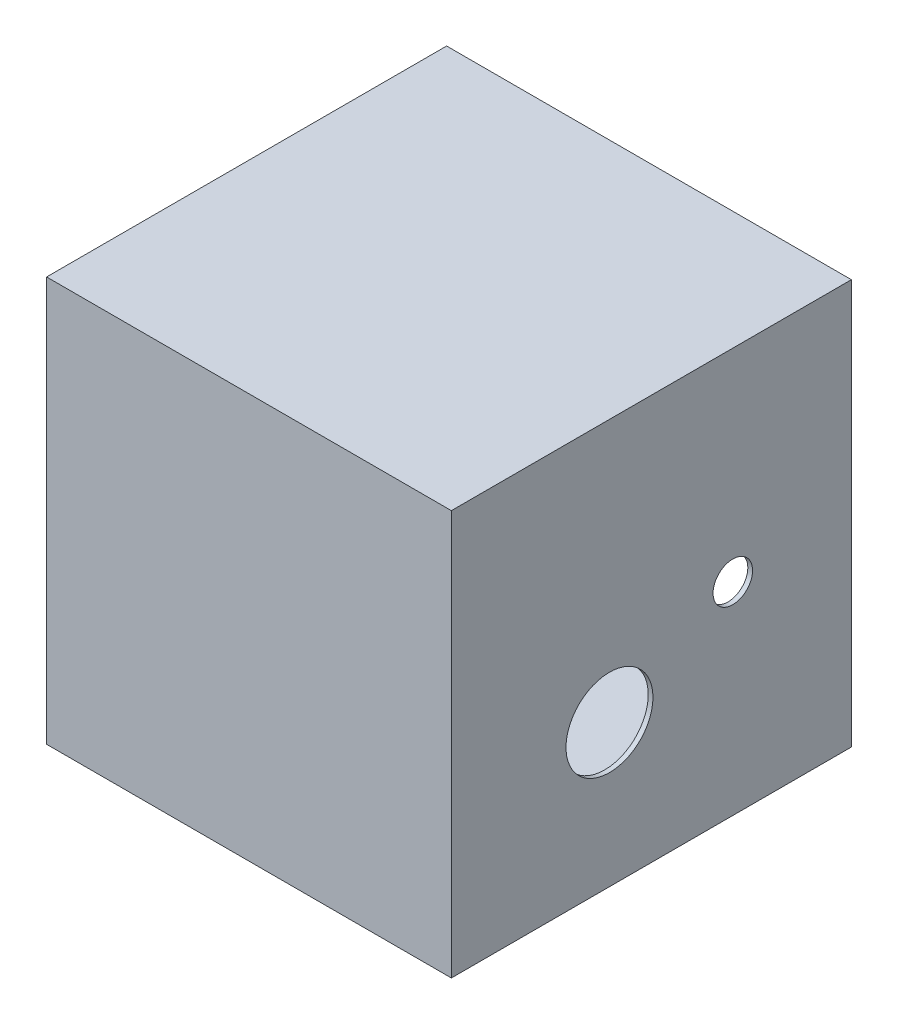
ISO-10303-21;
HEADER;
FILE_DESCRIPTION(('STEP AP214'),'2;1');
FILE_NAME('part.step','',(''),(''),'','','');
FILE_SCHEMA(('AUTOMOTIVE_DESIGN { 1 0 10303 214 1 1 1 1 }'));
ENDSEC;
DATA;
#1=APPLICATION_CONTEXT('core data for automotive mechanical design processes');
#2=APPLICATION_PROTOCOL_DEFINITION('international standard','automotive_design',2000,#1);
#3=PRODUCT_CONTEXT('',#1,'mechanical');
#4=PRODUCT('Part','Part','',(#3));
#5=PRODUCT_RELATED_PRODUCT_CATEGORY('part','',(#4));
#6=PRODUCT_DEFINITION_FORMATION('','',#4);
#7=PRODUCT_DEFINITION_CONTEXT('part definition',#1,'design');
#8=PRODUCT_DEFINITION('design','',#6,#7);
#9=PRODUCT_DEFINITION_SHAPE('','',#8);
#10=(LENGTH_UNIT() NAMED_UNIT(*) SI_UNIT(.MILLI.,.METRE.));
#11=(NAMED_UNIT(*) PLANE_ANGLE_UNIT() SI_UNIT($,.RADIAN.));
#12=(NAMED_UNIT(*) SI_UNIT($,.STERADIAN.) SOLID_ANGLE_UNIT());
#13=UNCERTAINTY_MEASURE_WITH_UNIT(LENGTH_MEASURE(1.E-05),#10,'distance_accuracy_value','');
#14=(GEOMETRIC_REPRESENTATION_CONTEXT(3) GLOBAL_UNCERTAINTY_ASSIGNED_CONTEXT((#13)) GLOBAL_UNIT_ASSIGNED_CONTEXT((#10,
#11,#12)) REPRESENTATION_CONTEXT('',''));
#15=CARTESIAN_POINT('',(0.,0.,0.));
#16=DIRECTION('',(0.,0.,1.));
#17=DIRECTION('',(1.,0.,0.));
#18=AXIS2_PLACEMENT_3D('',#15,#16,#17);
#19=CARTESIAN_POINT('',(0.,0.,0.));
#20=DIRECTION('',(0.,0.,-1.));
#21=DIRECTION('',(-1.,0.,0.));
#22=AXIS2_PLACEMENT_3D('',#19,#20,#21);
#23=PLANE('',#22);
#24=DIRECTION('',(0.,-1.,0.));
#25=VECTOR('',#24,1.);
#26=CARTESIAN_POINT('',(-25.6,-25.6,0.));
#27=LINE('',#26,#25);
#28=CARTESIAN_POINT('',(-25.6,25.6,0.));
#29=VERTEX_POINT('',#28);
#30=CARTESIAN_POINT('',(-25.6,-25.6,0.));
#31=VERTEX_POINT('',#30);
#32=EDGE_CURVE('E110',#29,#31,#27,.T.);
#33=ORIENTED_EDGE('',*,*,#32,.F.);
#34=DIRECTION('',(-1.,0.,0.));
#35=VECTOR('',#34,1.);
#36=CARTESIAN_POINT('',(-25.6,25.6,0.));
#37=LINE('',#36,#35);
#38=CARTESIAN_POINT('',(25.6,25.6,0.));
#39=VERTEX_POINT('',#38);
#40=EDGE_CURVE('E61',#39,#29,#37,.T.);
#41=ORIENTED_EDGE('',*,*,#40,.F.);
#42=DIRECTION('',(0.,1.,0.));
#43=VECTOR('',#42,1.);
#44=CARTESIAN_POINT('',(25.6,-25.6,0.));
#45=LINE('',#44,#43);
#46=CARTESIAN_POINT('',(25.6,-25.6,0.));
#47=VERTEX_POINT('',#46);
#48=EDGE_CURVE('E167',#47,#39,#45,.T.);
#49=ORIENTED_EDGE('',*,*,#48,.F.);
#50=DIRECTION('',(1.,0.,0.));
#51=VECTOR('',#50,1.);
#52=CARTESIAN_POINT('',(-25.6,-25.6,0.));
#53=LINE('',#52,#51);
#54=EDGE_CURVE('E165',#31,#47,#53,.T.);
#55=ORIENTED_EDGE('',*,*,#54,.F.);
#56=EDGE_LOOP('',(#33,#41,#49,#55));
#57=FACE_BOUND('',#56,.T.);
#58=DIRECTION('',(1.,0.,0.));
#59=VECTOR('',#58,1.);
#60=CARTESIAN_POINT('',(-25.,-25.,0.));
#61=LINE('',#60,#59);
#62=CARTESIAN_POINT('',(-25.,-25.,0.));
#63=VERTEX_POINT('',#62);
#64=CARTESIAN_POINT('',(25.,-25.,0.));
#65=VERTEX_POINT('',#64);
#66=EDGE_CURVE('E138',#63,#65,#61,.T.);
#67=ORIENTED_EDGE('',*,*,#66,.T.);
#68=DIRECTION('',(0.,1.,0.));
#69=VECTOR('',#68,1.);
#70=CARTESIAN_POINT('',(25.,-25.,0.));
#71=LINE('',#70,#69);
#72=CARTESIAN_POINT('',(25.,25.,0.));
#73=VERTEX_POINT('',#72);
#74=EDGE_CURVE('E53',#65,#73,#71,.T.);
#75=ORIENTED_EDGE('',*,*,#74,.T.);
#76=DIRECTION('',(-1.,0.,0.));
#77=VECTOR('',#76,1.);
#78=CARTESIAN_POINT('',(-25.,25.,0.));
#79=LINE('',#78,#77);
#80=CARTESIAN_POINT('',(-25.,25.,0.));
#81=VERTEX_POINT('',#80);
#82=EDGE_CURVE('E149',#73,#81,#79,.T.);
#83=ORIENTED_EDGE('',*,*,#82,.T.);
#84=DIRECTION('',(0.,-1.,0.));
#85=VECTOR('',#84,1.);
#86=CARTESIAN_POINT('',(-25.,-25.,0.));
#87=LINE('',#86,#85);
#88=EDGE_CURVE('E152',#81,#63,#87,.T.);
#89=ORIENTED_EDGE('',*,*,#88,.T.);
#90=EDGE_LOOP('',(#67,#75,#83,#89));
#91=FACE_BOUND('',#90,.T.);
#92=ADVANCED_FACE('F37',(#57,#91),#23,.T.);
#93=CARTESIAN_POINT('',(-25.6,-25.6,50.));
#94=DIRECTION('',(1.,0.,0.));
#95=DIRECTION('',(0.,0.,-1.));
#96=AXIS2_PLACEMENT_3D('',#93,#94,#95);
#97=PLANE('',#96);
#98=CARTESIAN_POINT('',(-25.6,0.,15.));
#99=DIRECTION('',(1.,0.,0.));
#100=DIRECTION('',(0.,0.,-1.));
#101=AXIS2_PLACEMENT_3D('',#98,#99,#100);
#102=CIRCLE('',#101,2.5);
#103=CARTESIAN_POINT('',(-25.6,0.,12.5));
#104=VERTEX_POINT('',#103);
#105=EDGE_CURVE('E234',#104,#104,#102,.T.);
#106=ORIENTED_EDGE('',*,*,#105,.T.);
#107=EDGE_LOOP('',(#106));
#108=FACE_BOUND('',#107,.T.);
#109=ORIENTED_EDGE('',*,*,#32,.T.);
#110=DIRECTION('',(0.,0.,-1.));
#111=VECTOR('',#110,1.);
#112=CARTESIAN_POINT('',(-25.6,-25.6,50.));
#113=LINE('',#112,#111);
#114=CARTESIAN_POINT('',(-25.6,-25.6,50.6));
#115=VERTEX_POINT('',#114);
#116=EDGE_CURVE('E11',#115,#31,#113,.T.);
#117=ORIENTED_EDGE('',*,*,#116,.F.);
#118=DIRECTION('',(0.,-1.,0.));
#119=VECTOR('',#118,1.);
#120=CARTESIAN_POINT('',(-25.6,25.6,50.6));
#121=LINE('',#120,#119);
#122=CARTESIAN_POINT('',(-25.6,25.6,50.6));
#123=VERTEX_POINT('',#122);
#124=EDGE_CURVE('E108',#123,#115,#121,.T.);
#125=ORIENTED_EDGE('',*,*,#124,.F.);
#126=DIRECTION('',(0.,0.,-1.));
#127=VECTOR('',#126,1.);
#128=CARTESIAN_POINT('',(-25.6,25.6,50.));
#129=LINE('',#128,#127);
#130=EDGE_CURVE('E170',#123,#29,#129,.T.);
#131=ORIENTED_EDGE('',*,*,#130,.T.);
#132=EDGE_LOOP('',(#109,#117,#125,#131));
#133=FACE_BOUND('',#132,.T.);
#134=ADVANCED_FACE('F39',(#108,#133),#97,.F.);
#135=CARTESIAN_POINT('',(-25.6,-25.6,50.));
#136=DIRECTION('',(0.,1.,0.));
#137=DIRECTION('',(0.,0.,1.));
#138=AXIS2_PLACEMENT_3D('',#135,#136,#137);
#139=PLANE('',#138);
#140=CARTESIAN_POINT('',(0.,-25.6,38.6));
#141=DIRECTION('',(0.,-1.,0.));
#142=DIRECTION('',(0.,0.,-1.));
#143=AXIS2_PLACEMENT_3D('',#140,#141,#142);
#144=CIRCLE('',#143,2.5);
#145=CARTESIAN_POINT('',(0.,-25.6,36.1));
#146=VERTEX_POINT('',#145);
#147=EDGE_CURVE('E228',#146,#146,#144,.T.);
#148=ORIENTED_EDGE('',*,*,#147,.F.);
#149=EDGE_LOOP('',(#148));
#150=FACE_BOUND('',#149,.T.);
#151=ORIENTED_EDGE('',*,*,#54,.T.);
#152=DIRECTION('',(0.,0.,-1.));
#153=VECTOR('',#152,1.);
#154=CARTESIAN_POINT('',(25.6,-25.6,50.));
#155=LINE('',#154,#153);
#156=CARTESIAN_POINT('',(25.6,-25.6,50.6));
#157=VERTEX_POINT('',#156);
#158=EDGE_CURVE('E46',#157,#47,#155,.T.);
#159=ORIENTED_EDGE('',*,*,#158,.F.);
#160=DIRECTION('',(1.,0.,0.));
#161=VECTOR('',#160,1.);
#162=CARTESIAN_POINT('',(-25.6,-25.6,50.6));
#163=LINE('',#162,#161);
#164=EDGE_CURVE('E113',#115,#157,#163,.T.);
#165=ORIENTED_EDGE('',*,*,#164,.F.);
#166=ORIENTED_EDGE('',*,*,#116,.T.);
#167=EDGE_LOOP('',(#151,#159,#165,#166));
#168=FACE_BOUND('',#167,.T.);
#169=ADVANCED_FACE('F114',(#150,#168),#139,.F.);
#170=CARTESIAN_POINT('',(25.6,-25.6,50.));
#171=DIRECTION('',(-1.,0.,0.));
#172=DIRECTION('',(0.,0.,1.));
#173=AXIS2_PLACEMENT_3D('',#170,#171,#172);
#174=PLANE('',#173);
#175=CARTESIAN_POINT('',(25.6,0.,15.));
#176=DIRECTION('',(1.,0.,0.));
#177=DIRECTION('',(0.,0.,-1.));
#178=AXIS2_PLACEMENT_3D('',#175,#176,#177);
#179=CIRCLE('',#178,2.5);
#180=CARTESIAN_POINT('',(25.6,0.,12.5));
#181=VERTEX_POINT('',#180);
#182=EDGE_CURVE('E230',#181,#181,#179,.T.);
#183=ORIENTED_EDGE('',*,*,#182,.F.);
#184=EDGE_LOOP('',(#183));
#185=FACE_BOUND('',#184,.T.);
#186=CARTESIAN_POINT('',(25.6,-7.60000000000001,30.6));
#187=DIRECTION('',(1.,0.,0.));
#188=DIRECTION('',(0.,0.,-1.));
#189=AXIS2_PLACEMENT_3D('',#186,#187,#188);
#190=CIRCLE('',#189,5.5);
#191=CARTESIAN_POINT('',(25.6,-7.60000000000001,25.1));
#192=VERTEX_POINT('',#191);
#193=EDGE_CURVE('E128',#192,#192,#190,.T.);
#194=ORIENTED_EDGE('',*,*,#193,.F.);
#195=EDGE_LOOP('',(#194));
#196=FACE_BOUND('',#195,.T.);
#197=ORIENTED_EDGE('',*,*,#48,.T.);
#198=DIRECTION('',(0.,0.,-1.));
#199=VECTOR('',#198,1.);
#200=CARTESIAN_POINT('',(25.6,25.6,50.));
#201=LINE('',#200,#199);
#202=CARTESIAN_POINT('',(25.6,25.6,50.6));
#203=VERTEX_POINT('',#202);
#204=EDGE_CURVE('E172',#203,#39,#201,.T.);
#205=ORIENTED_EDGE('',*,*,#204,.F.);
#206=DIRECTION('',(0.,1.,0.));
#207=VECTOR('',#206,1.);
#208=CARTESIAN_POINT('',(25.6,-25.6,50.6));
#209=LINE('',#208,#207);
#210=EDGE_CURVE('E119',#157,#203,#209,.T.);
#211=ORIENTED_EDGE('',*,*,#210,.F.);
#212=ORIENTED_EDGE('',*,*,#158,.T.);
#213=EDGE_LOOP('',(#197,#205,#211,#212));
#214=FACE_BOUND('',#213,.T.);
#215=ADVANCED_FACE('F176',(#185,#196,#214),#174,.F.);
#216=CARTESIAN_POINT('',(-25.6,25.6,50.));
#217=DIRECTION('',(0.,-1.,0.));
#218=DIRECTION('',(0.,0.,-1.));
#219=AXIS2_PLACEMENT_3D('',#216,#217,#218);
#220=PLANE('',#219);
#221=ORIENTED_EDGE('',*,*,#40,.T.);
#222=ORIENTED_EDGE('',*,*,#130,.F.);
#223=DIRECTION('',(-1.,0.,0.));
#224=VECTOR('',#223,1.);
#225=CARTESIAN_POINT('',(25.6,25.6,50.6));
#226=LINE('',#225,#224);
#227=EDGE_CURVE('E124',#203,#123,#226,.T.);
#228=ORIENTED_EDGE('',*,*,#227,.F.);
#229=ORIENTED_EDGE('',*,*,#204,.T.);
#230=EDGE_LOOP('',(#221,#222,#228,#229));
#231=FACE_BOUND('',#230,.T.);
#232=ADVANCED_FACE('F213',(#231),#220,.F.);
#233=CARTESIAN_POINT('',(25.,-25.,50.));
#234=DIRECTION('',(-1.,0.,0.));
#235=DIRECTION('',(0.,0.,1.));
#236=AXIS2_PLACEMENT_3D('',#233,#234,#235);
#237=PLANE('',#236);
#238=CARTESIAN_POINT('',(25.,0.,15.));
#239=DIRECTION('',(-1.,0.,0.));
#240=DIRECTION('',(0.,0.,1.));
#241=AXIS2_PLACEMENT_3D('',#238,#239,#240);
#242=CIRCLE('',#241,2.5);
#243=CARTESIAN_POINT('',(25.,0.,17.5));
#244=VERTEX_POINT('',#243);
#245=EDGE_CURVE('E241',#244,#244,#242,.T.);
#246=ORIENTED_EDGE('',*,*,#245,.F.);
#247=EDGE_LOOP('',(#246));
#248=FACE_BOUND('',#247,.T.);
#249=CARTESIAN_POINT('',(25.,-7.60000000000001,30.6));
#250=DIRECTION('',(-1.,0.,0.));
#251=DIRECTION('',(0.,0.,1.));
#252=AXIS2_PLACEMENT_3D('',#249,#250,#251);
#253=CIRCLE('',#252,5.5);
#254=CARTESIAN_POINT('',(25.,-7.60000000000001,36.1));
#255=VERTEX_POINT('',#254);
#256=EDGE_CURVE('E125',#255,#255,#253,.F.);
#257=ORIENTED_EDGE('',*,*,#256,.T.);
#258=EDGE_LOOP('',(#257));
#259=FACE_BOUND('',#258,.T.);
#260=ORIENTED_EDGE('',*,*,#74,.F.);
#261=DIRECTION('',(0.,0.,-1.));
#262=VECTOR('',#261,1.);
#263=CARTESIAN_POINT('',(25.,-25.,50.));
#264=LINE('',#263,#262);
#265=CARTESIAN_POINT('',(25.,-25.,50.));
#266=VERTEX_POINT('',#265);
#267=EDGE_CURVE('E147',#266,#65,#264,.T.);
#268=ORIENTED_EDGE('',*,*,#267,.F.);
#269=DIRECTION('',(0.,1.,0.));
#270=VECTOR('',#269,1.);
#271=CARTESIAN_POINT('',(25.,-25.,50.));
#272=LINE('',#271,#270);
#273=CARTESIAN_POINT('',(25.,25.,50.));
#274=VERTEX_POINT('',#273);
#275=EDGE_CURVE('E134',#266,#274,#272,.T.);
#276=ORIENTED_EDGE('',*,*,#275,.T.);
#277=DIRECTION('',(0.,0.,-1.));
#278=VECTOR('',#277,1.);
#279=CARTESIAN_POINT('',(25.,25.,50.));
#280=LINE('',#279,#278);
#281=EDGE_CURVE('E162',#274,#73,#280,.T.);
#282=ORIENTED_EDGE('',*,*,#281,.T.);
#283=EDGE_LOOP('',(#260,#268,#276,#282));
#284=FACE_BOUND('',#283,.T.);
#285=ADVANCED_FACE('F186',(#248,#259,#284),#237,.T.);
#286=CARTESIAN_POINT('',(-25.,25.,50.));
#287=DIRECTION('',(0.,-1.,0.));
#288=DIRECTION('',(0.,0.,-1.));
#289=AXIS2_PLACEMENT_3D('',#286,#287,#288);
#290=PLANE('',#289);
#291=ORIENTED_EDGE('',*,*,#82,.F.);
#292=ORIENTED_EDGE('',*,*,#281,.F.);
#293=DIRECTION('',(-1.,0.,0.));
#294=VECTOR('',#293,1.);
#295=CARTESIAN_POINT('',(-25.,25.,50.));
#296=LINE('',#295,#294);
#297=CARTESIAN_POINT('',(-25.,25.,50.));
#298=VERTEX_POINT('',#297);
#299=EDGE_CURVE('E137',#274,#298,#296,.T.);
#300=ORIENTED_EDGE('',*,*,#299,.T.);
#301=DIRECTION('',(0.,0.,-1.));
#302=VECTOR('',#301,1.);
#303=CARTESIAN_POINT('',(-25.,25.,50.));
#304=LINE('',#303,#302);
#305=EDGE_CURVE('E160',#298,#81,#304,.T.);
#306=ORIENTED_EDGE('',*,*,#305,.T.);
#307=EDGE_LOOP('',(#291,#292,#300,#306));
#308=FACE_BOUND('',#307,.T.);
#309=ADVANCED_FACE('F190',(#308),#290,.T.);
#310=CARTESIAN_POINT('',(-25.,-25.,50.));
#311=DIRECTION('',(1.,0.,0.));
#312=DIRECTION('',(0.,0.,-1.));
#313=AXIS2_PLACEMENT_3D('',#310,#311,#312);
#314=PLANE('',#313);
#315=CARTESIAN_POINT('',(-25.,0.,15.));
#316=DIRECTION('',(1.,0.,0.));
#317=DIRECTION('',(0.,0.,-1.));
#318=AXIS2_PLACEMENT_3D('',#315,#316,#317);
#319=CIRCLE('',#318,2.5);
#320=CARTESIAN_POINT('',(-25.,0.,12.5));
#321=VERTEX_POINT('',#320);
#322=EDGE_CURVE('E41',#321,#321,#319,.T.);
#323=ORIENTED_EDGE('',*,*,#322,.F.);
#324=EDGE_LOOP('',(#323));
#325=FACE_BOUND('',#324,.T.);
#326=ORIENTED_EDGE('',*,*,#88,.F.);
#327=ORIENTED_EDGE('',*,*,#305,.F.);
#328=DIRECTION('',(0.,-1.,0.));
#329=VECTOR('',#328,1.);
#330=CARTESIAN_POINT('',(-25.,-25.,50.));
#331=LINE('',#330,#329);
#332=CARTESIAN_POINT('',(-25.,-25.,50.));
#333=VERTEX_POINT('',#332);
#334=EDGE_CURVE('E141',#298,#333,#331,.T.);
#335=ORIENTED_EDGE('',*,*,#334,.T.);
#336=DIRECTION('',(0.,0.,-1.));
#337=VECTOR('',#336,1.);
#338=CARTESIAN_POINT('',(-25.,-25.,50.));
#339=LINE('',#338,#337);
#340=EDGE_CURVE('E158',#333,#63,#339,.T.);
#341=ORIENTED_EDGE('',*,*,#340,.T.);
#342=EDGE_LOOP('',(#326,#327,#335,#341));
#343=FACE_BOUND('',#342,.T.);
#344=ADVANCED_FACE('F193',(#325,#343),#314,.T.);
#345=CARTESIAN_POINT('',(-25.,-25.,50.));
#346=DIRECTION('',(0.,1.,0.));
#347=DIRECTION('',(0.,0.,1.));
#348=AXIS2_PLACEMENT_3D('',#345,#346,#347);
#349=PLANE('',#348);
#350=CARTESIAN_POINT('',(0.,-25.,38.6));
#351=DIRECTION('',(0.,1.,0.));
#352=DIRECTION('',(0.,0.,1.));
#353=AXIS2_PLACEMENT_3D('',#350,#351,#352);
#354=CIRCLE('',#353,2.5);
#355=CARTESIAN_POINT('',(0.,-25.,41.1));
#356=VERTEX_POINT('',#355);
#357=EDGE_CURVE('E231',#356,#356,#354,.F.);
#358=ORIENTED_EDGE('',*,*,#357,.T.);
#359=EDGE_LOOP('',(#358));
#360=FACE_BOUND('',#359,.T.);
#361=ORIENTED_EDGE('',*,*,#66,.F.);
#362=ORIENTED_EDGE('',*,*,#340,.F.);
#363=DIRECTION('',(1.,0.,0.));
#364=VECTOR('',#363,1.);
#365=CARTESIAN_POINT('',(-25.,-25.,50.));
#366=LINE('',#365,#364);
#367=EDGE_CURVE('E144',#333,#266,#366,.T.);
#368=ORIENTED_EDGE('',*,*,#367,.T.);
#369=ORIENTED_EDGE('',*,*,#267,.T.);
#370=EDGE_LOOP('',(#361,#362,#368,#369));
#371=FACE_BOUND('',#370,.T.);
#372=ADVANCED_FACE('F185',(#360,#371),#349,.T.);
#373=CARTESIAN_POINT('',(0.,0.,50.));
#374=DIRECTION('',(0.,0.,1.));
#375=DIRECTION('',(1.,0.,0.));
#376=AXIS2_PLACEMENT_3D('',#373,#374,#375);
#377=PLANE('',#376);
#378=ORIENTED_EDGE('',*,*,#275,.F.);
#379=ORIENTED_EDGE('',*,*,#367,.F.);
#380=ORIENTED_EDGE('',*,*,#334,.F.);
#381=ORIENTED_EDGE('',*,*,#299,.F.);
#382=EDGE_LOOP('',(#378,#379,#380,#381));
#383=FACE_BOUND('',#382,.T.);
#384=ADVANCED_FACE('F194',(#383),#377,.F.);
#385=CARTESIAN_POINT('',(0.,0.,50.6));
#386=DIRECTION('',(0.,0.,1.));
#387=DIRECTION('',(1.,0.,0.));
#388=AXIS2_PLACEMENT_3D('',#385,#386,#387);
#389=PLANE('',#388);
#390=ORIENTED_EDGE('',*,*,#124,.T.);
#391=ORIENTED_EDGE('',*,*,#164,.T.);
#392=ORIENTED_EDGE('',*,*,#210,.T.);
#393=ORIENTED_EDGE('',*,*,#227,.T.);
#394=EDGE_LOOP('',(#390,#391,#392,#393));
#395=FACE_BOUND('',#394,.T.);
#396=ADVANCED_FACE('F122',(#395),#389,.T.);
#397=CARTESIAN_POINT('',(9.44365081389597,-7.60000000000001,30.6));
#398=DIRECTION('',(1.,0.,0.));
#399=DIRECTION('',(0.,0.,-1.));
#400=AXIS2_PLACEMENT_3D('',#397,#398,#399);
#401=CYLINDRICAL_SURFACE('',#400,5.5);
#402=ORIENTED_EDGE('',*,*,#193,.T.);
#403=EDGE_LOOP('',(#402));
#404=FACE_BOUND('',#403,.T.);
#405=ORIENTED_EDGE('',*,*,#256,.F.);
#406=EDGE_LOOP('',(#405));
#407=FACE_BOUND('',#406,.T.);
#408=ADVANCED_FACE('F201',(#404,#407),#401,.F.);
#409=CARTESIAN_POINT('',(-25.6,0.,15.));
#410=DIRECTION('',(1.,0.,0.));
#411=DIRECTION('',(0.,0.,-1.));
#412=AXIS2_PLACEMENT_3D('',#409,#410,#411);
#413=CYLINDRICAL_SURFACE('',#412,2.5);
#414=ORIENTED_EDGE('',*,*,#322,.T.);
#415=EDGE_LOOP('',(#414));
#416=FACE_BOUND('',#415,.T.);
#417=ORIENTED_EDGE('',*,*,#105,.F.);
#418=EDGE_LOOP('',(#417));
#419=FACE_BOUND('',#418,.T.);
#420=ADVANCED_FACE('F249',(#416,#419),#413,.F.);
#421=ORIENTED_EDGE('',*,*,#245,.T.);
#422=EDGE_LOOP('',(#421));
#423=FACE_BOUND('',#422,.T.);
#424=ORIENTED_EDGE('',*,*,#182,.T.);
#425=EDGE_LOOP('',(#424));
#426=FACE_BOUND('',#425,.T.);
#427=ADVANCED_FACE('F255',(#423,#426),#413,.F.);
#428=CARTESIAN_POINT('',(0.,25.601,38.6));
#429=DIRECTION('',(0.,-1.,0.));
#430=DIRECTION('',(0.,0.,-1.));
#431=AXIS2_PLACEMENT_3D('',#428,#429,#430);
#432=CYLINDRICAL_SURFACE('',#431,2.5);
#433=ORIENTED_EDGE('',*,*,#357,.F.);
#434=EDGE_LOOP('',(#433));
#435=FACE_BOUND('',#434,.T.);
#436=ORIENTED_EDGE('',*,*,#147,.T.);
#437=EDGE_LOOP('',(#436));
#438=FACE_BOUND('',#437,.T.);
#439=ADVANCED_FACE('F259',(#435,#438),#432,.F.);
#440=CLOSED_SHELL('',(#92,#134,#169,#215,#232,#285,#309,#344,#372,#384,#396,#408,#420,#427,#439));
#441=MANIFOLD_SOLID_BREP('B2',#440);
#442=ADVANCED_BREP_SHAPE_REPRESENTATION('',(#18,#441),#14);
#443=SHAPE_DEFINITION_REPRESENTATION(#9,#442);
ENDSEC;
END-ISO-10303-21;
